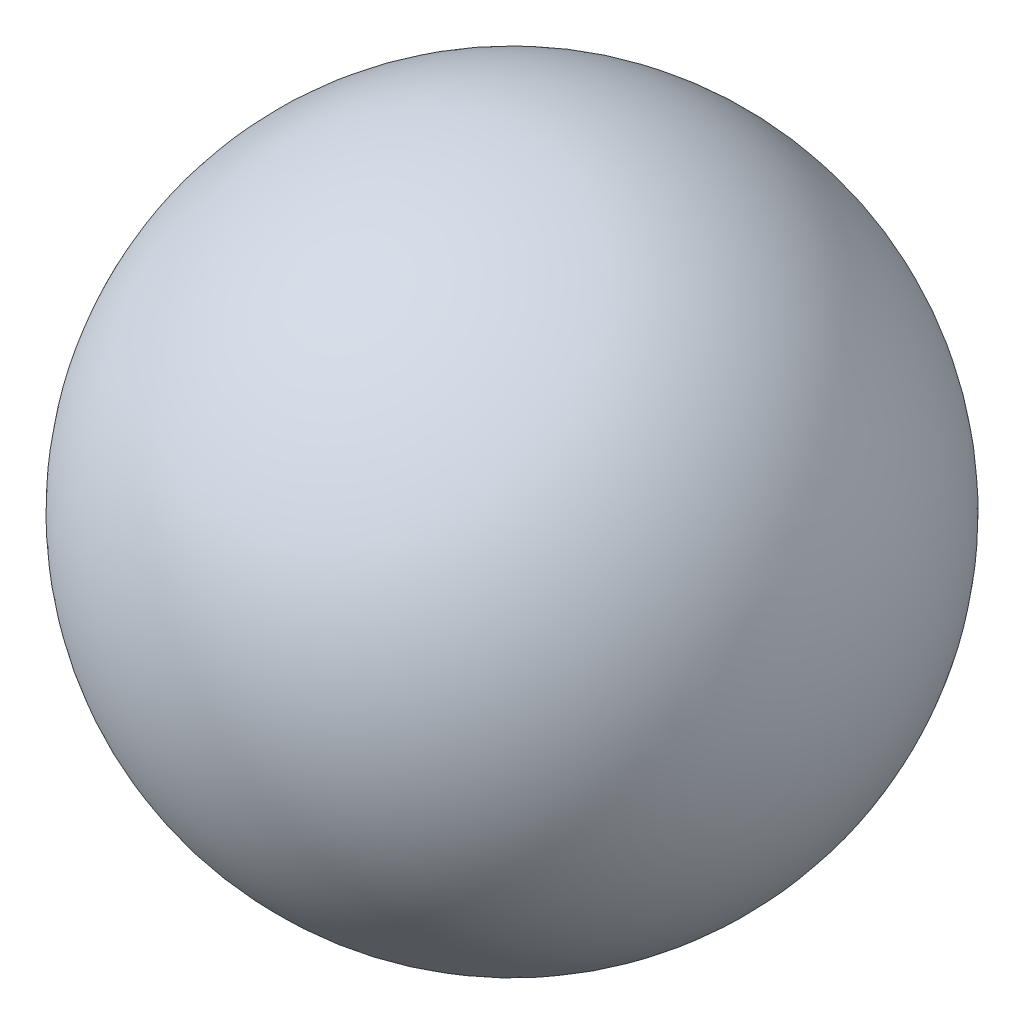
ISO-10303-21;
HEADER;
FILE_DESCRIPTION(('STEP AP214'),'2;1');
FILE_NAME('part.step','',(''),(''),'','','');
FILE_SCHEMA(('AUTOMOTIVE_DESIGN { 1 0 10303 214 1 1 1 1 }'));
ENDSEC;
DATA;
#1=APPLICATION_CONTEXT('core data for automotive mechanical design processes');
#2=APPLICATION_PROTOCOL_DEFINITION('international standard','automotive_design',2000,#1);
#3=PRODUCT_CONTEXT('',#1,'mechanical');
#4=PRODUCT('Part','Part','',(#3));
#5=PRODUCT_RELATED_PRODUCT_CATEGORY('part','',(#4));
#6=PRODUCT_DEFINITION_FORMATION('','',#4);
#7=PRODUCT_DEFINITION_CONTEXT('part definition',#1,'design');
#8=PRODUCT_DEFINITION('design','',#6,#7);
#9=PRODUCT_DEFINITION_SHAPE('','',#8);
#10=(LENGTH_UNIT() NAMED_UNIT(*) SI_UNIT(.MILLI.,.METRE.));
#11=(NAMED_UNIT(*) PLANE_ANGLE_UNIT() SI_UNIT($,.RADIAN.));
#12=(NAMED_UNIT(*) SI_UNIT($,.STERADIAN.) SOLID_ANGLE_UNIT());
#13=UNCERTAINTY_MEASURE_WITH_UNIT(LENGTH_MEASURE(1.E-05),#10,'distance_accuracy_value','');
#14=(GEOMETRIC_REPRESENTATION_CONTEXT(3) GLOBAL_UNCERTAINTY_ASSIGNED_CONTEXT((#13)) GLOBAL_UNIT_ASSIGNED_CONTEXT((#10,
#11,#12)) REPRESENTATION_CONTEXT('',''));
#15=CARTESIAN_POINT('',(0.,0.,0.));
#16=DIRECTION('',(0.,0.,1.));
#17=DIRECTION('',(1.,0.,0.));
#18=AXIS2_PLACEMENT_3D('',#15,#16,#17);
#19=CARTESIAN_POINT('',(0.,0.,0.));
#20=DIRECTION('',(-1.,0.,0.));
#21=DIRECTION('',(0.,0.,-1.));
#22=AXIS2_PLACEMENT_3D('',#19,#20,#21);
#23=SPHERICAL_SURFACE('',#22,43.775);
#24=CARTESIAN_POINT('',(-43.775,0.,0.));
#25=VERTEX_POINT('',#24);
#26=VERTEX_LOOP('',#25);
#27=FACE_BOUND('',#26,.T.);
#28=ADVANCED_FACE('F37',(#27),#23,.T.);
#29=CLOSED_SHELL('',(#28));
#30=MANIFOLD_SOLID_BREP('B2',#29);
#31=ADVANCED_BREP_SHAPE_REPRESENTATION('',(#18,#30),#14);
#32=SHAPE_DEFINITION_REPRESENTATION(#9,#31);
ENDSEC;
END-ISO-10303-21;
